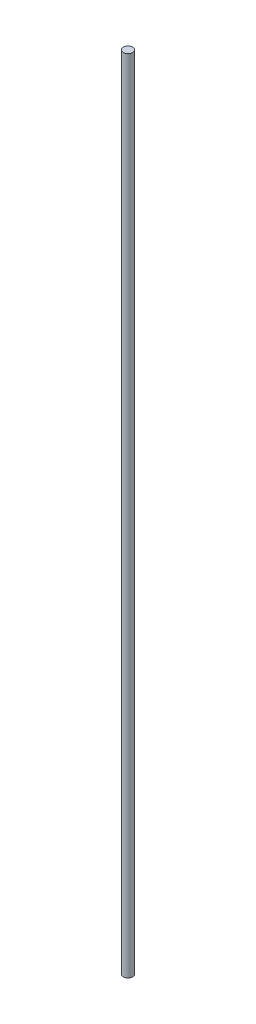
ISO-10303-21;
HEADER;
FILE_DESCRIPTION(('STEP AP214'),'2;1');
FILE_NAME('part.step','',(''),(''),'','','');
FILE_SCHEMA(('AUTOMOTIVE_DESIGN { 1 0 10303 214 1 1 1 1 }'));
ENDSEC;
DATA;
#1=APPLICATION_CONTEXT('core data for automotive mechanical design processes');
#2=APPLICATION_PROTOCOL_DEFINITION('international standard','automotive_design',2000,#1);
#3=PRODUCT_CONTEXT('',#1,'mechanical');
#4=PRODUCT('Part','Part','',(#3));
#5=PRODUCT_RELATED_PRODUCT_CATEGORY('part','',(#4));
#6=PRODUCT_DEFINITION_FORMATION('','',#4);
#7=PRODUCT_DEFINITION_CONTEXT('part definition',#1,'design');
#8=PRODUCT_DEFINITION('design','',#6,#7);
#9=PRODUCT_DEFINITION_SHAPE('','',#8);
#10=(LENGTH_UNIT() NAMED_UNIT(*) SI_UNIT(.MILLI.,.METRE.));
#11=(NAMED_UNIT(*) PLANE_ANGLE_UNIT() SI_UNIT($,.RADIAN.));
#12=(NAMED_UNIT(*) SI_UNIT($,.STERADIAN.) SOLID_ANGLE_UNIT());
#13=UNCERTAINTY_MEASURE_WITH_UNIT(LENGTH_MEASURE(1.E-05),#10,'distance_accuracy_value','');
#14=(GEOMETRIC_REPRESENTATION_CONTEXT(3) GLOBAL_UNCERTAINTY_ASSIGNED_CONTEXT((#13)) GLOBAL_UNIT_ASSIGNED_CONTEXT((#10,
#11,#12)) REPRESENTATION_CONTEXT('',''));
#15=CARTESIAN_POINT('',(0.,0.,0.));
#16=DIRECTION('',(0.,0.,1.));
#17=DIRECTION('',(1.,0.,0.));
#18=AXIS2_PLACEMENT_3D('',#15,#16,#17);
#19=CARTESIAN_POINT('',(0.,-128.,0.));
#20=DIRECTION('',(0.,1.,0.));
#21=DIRECTION('',(0.,0.,1.));
#22=AXIS2_PLACEMENT_3D('',#19,#20,#21);
#23=CYLINDRICAL_SURFACE('',#22,1.5);
#24=CARTESIAN_POINT('',(0.,-128.,0.));
#25=DIRECTION('',(0.,1.,0.));
#26=DIRECTION('',(0.,0.,1.));
#27=AXIS2_PLACEMENT_3D('',#24,#25,#26);
#28=CIRCLE('',#27,1.5);
#29=CARTESIAN_POINT('',(0.,-128.,1.5));
#30=VERTEX_POINT('',#29);
#31=EDGE_CURVE('E10',#30,#30,#28,.T.);
#32=ORIENTED_EDGE('',*,*,#31,.T.);
#33=EDGE_LOOP('',(#32));
#34=FACE_BOUND('',#33,.T.);
#35=CARTESIAN_POINT('',(0.,128.,0.));
#36=DIRECTION('',(0.,1.,0.));
#37=DIRECTION('',(0.,0.,1.));
#38=AXIS2_PLACEMENT_3D('',#35,#36,#37);
#39=CIRCLE('',#38,1.5);
#40=CARTESIAN_POINT('',(0.,128.,1.5));
#41=VERTEX_POINT('',#40);
#42=EDGE_CURVE('E50',#41,#41,#39,.T.);
#43=ORIENTED_EDGE('',*,*,#42,.F.);
#44=EDGE_LOOP('',(#43));
#45=FACE_BOUND('',#44,.T.);
#46=ADVANCED_FACE('F43',(#34,#45),#23,.T.);
#47=CARTESIAN_POINT('',(0.,-128.,0.));
#48=DIRECTION('',(0.,1.,0.));
#49=DIRECTION('',(0.,0.,1.));
#50=AXIS2_PLACEMENT_3D('',#47,#48,#49);
#51=PLANE('',#50);
#52=ORIENTED_EDGE('',*,*,#31,.F.);
#53=EDGE_LOOP('',(#52));
#54=FACE_BOUND('',#53,.T.);
#55=ADVANCED_FACE('F60',(#54),#51,.F.);
#56=CARTESIAN_POINT('',(0.,128.,0.));
#57=DIRECTION('',(0.,1.,0.));
#58=DIRECTION('',(0.,0.,1.));
#59=AXIS2_PLACEMENT_3D('',#56,#57,#58);
#60=PLANE('',#59);
#61=ORIENTED_EDGE('',*,*,#42,.T.);
#62=EDGE_LOOP('',(#61));
#63=FACE_BOUND('',#62,.T.);
#64=ADVANCED_FACE('F57',(#63),#60,.T.);
#65=CLOSED_SHELL('',(#46,#55,#64));
#66=MANIFOLD_SOLID_BREP('B2',#65);
#67=ADVANCED_BREP_SHAPE_REPRESENTATION('',(#18,#66),#14);
#68=SHAPE_DEFINITION_REPRESENTATION(#9,#67);
ENDSEC;
END-ISO-10303-21;
